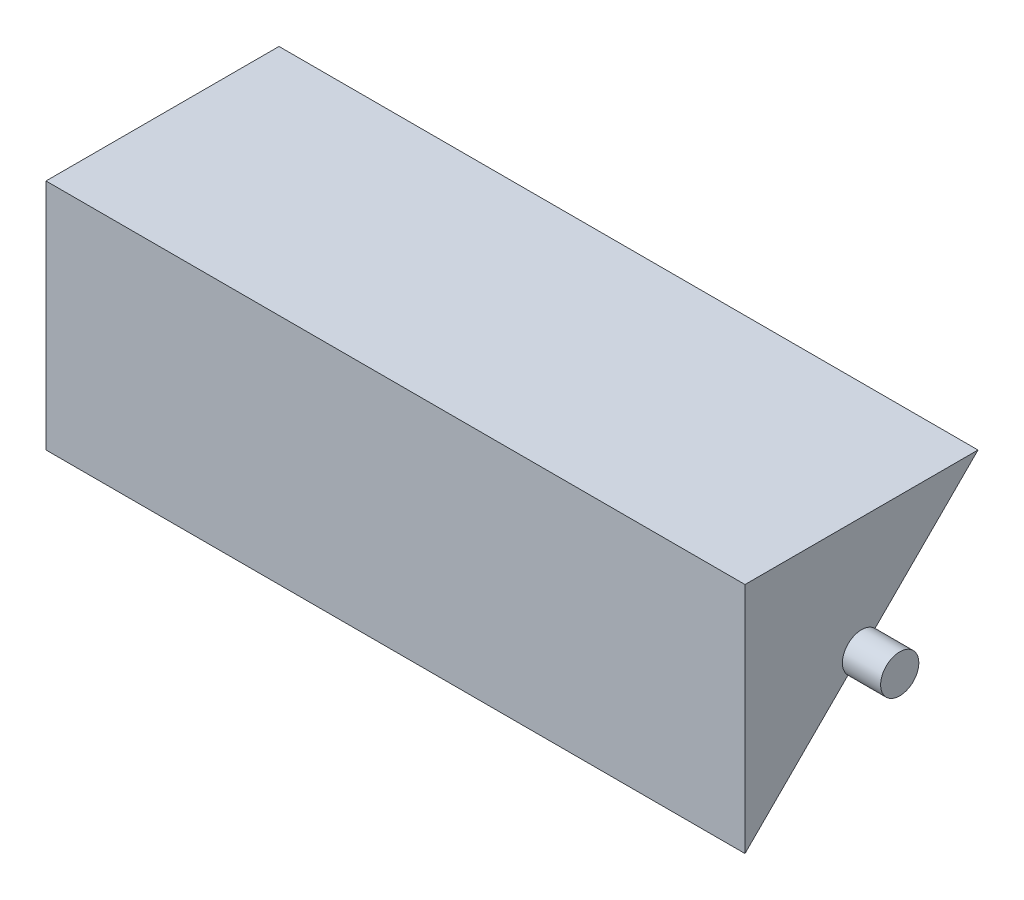
ISO-10303-21;
HEADER;
FILE_DESCRIPTION(('STEP AP214'),'2;1');
FILE_NAME('part.step','',(''),(''),'','','');
FILE_SCHEMA(('AUTOMOTIVE_DESIGN { 1 0 10303 214 1 1 1 1 }'));
ENDSEC;
DATA;
#1=APPLICATION_CONTEXT('core data for automotive mechanical design processes');
#2=APPLICATION_PROTOCOL_DEFINITION('international standard','automotive_design',2000,#1);
#3=PRODUCT_CONTEXT('',#1,'mechanical');
#4=PRODUCT('Part','Part','',(#3));
#5=PRODUCT_RELATED_PRODUCT_CATEGORY('part','',(#4));
#6=PRODUCT_DEFINITION_FORMATION('','',#4);
#7=PRODUCT_DEFINITION_CONTEXT('part definition',#1,'design');
#8=PRODUCT_DEFINITION('design','',#6,#7);
#9=PRODUCT_DEFINITION_SHAPE('','',#8);
#10=(LENGTH_UNIT() NAMED_UNIT(*) SI_UNIT(.MILLI.,.METRE.));
#11=(NAMED_UNIT(*) PLANE_ANGLE_UNIT() SI_UNIT($,.RADIAN.));
#12=(NAMED_UNIT(*) SI_UNIT($,.STERADIAN.) SOLID_ANGLE_UNIT());
#13=UNCERTAINTY_MEASURE_WITH_UNIT(LENGTH_MEASURE(1.E-05),#10,'distance_accuracy_value','');
#14=(GEOMETRIC_REPRESENTATION_CONTEXT(3) GLOBAL_UNCERTAINTY_ASSIGNED_CONTEXT((#13)) GLOBAL_UNIT_ASSIGNED_CONTEXT((#10,
#11,#12)) REPRESENTATION_CONTEXT('',''));
#15=CARTESIAN_POINT('',(0.,0.,0.));
#16=DIRECTION('',(0.,0.,1.));
#17=DIRECTION('',(1.,0.,0.));
#18=AXIS2_PLACEMENT_3D('',#15,#16,#17);
#19=CARTESIAN_POINT('',(-888.252293811319,-152.4,304.8));
#20=DIRECTION('',(0.,0.707106781186547,0.707106781186548));
#21=DIRECTION('',(0.,-0.707106781186548,0.707106781186547));
#22=AXIS2_PLACEMENT_3D('',#19,#20,#21);
#23=PLANE('',#22);
#24=DIRECTION('',(0.,0.707106781186548,-0.707106781186547));
#25=VECTOR('',#24,1.);
#26=CARTESIAN_POINT('',(-457.2,-152.4,304.8));
#27=LINE('',#26,#25);
#28=CARTESIAN_POINT('',(-457.2,-152.4,304.8));
#29=VERTEX_POINT('',#28);
#30=CARTESIAN_POINT('',(-457.2,-17.6776695296637,170.077669529664));
#31=VERTEX_POINT('',#30);
#32=EDGE_CURVE('E120',#29,#31,#27,.T.);
#33=ORIENTED_EDGE('',*,*,#32,.T.);
#34=DIRECTION('',(1.,0.,0.));
#35=VECTOR('',#34,1.);
#36=CARTESIAN_POINT('',(-518.8,-17.6776695296637,170.077669529664));
#37=LINE('',#36,#35);
#38=CARTESIAN_POINT('',(457.2,-17.6776695296637,170.077669529664));
#39=VERTEX_POINT('',#38);
#40=EDGE_CURVE('E11',#31,#39,#37,.T.);
#41=ORIENTED_EDGE('',*,*,#40,.T.);
#42=DIRECTION('',(0.,-0.707106781186548,0.707106781186547));
#43=VECTOR('',#42,1.);
#44=CARTESIAN_POINT('',(457.2,-152.4,304.8));
#45=LINE('',#44,#43);
#46=CARTESIAN_POINT('',(457.2,-152.4,304.8));
#47=VERTEX_POINT('',#46);
#48=EDGE_CURVE('E111',#39,#47,#45,.T.);
#49=ORIENTED_EDGE('',*,*,#48,.T.);
#50=DIRECTION('',(1.,0.,0.));
#51=VECTOR('',#50,1.);
#52=CARTESIAN_POINT('',(-457.2,-152.4,304.8));
#53=LINE('',#52,#51);
#54=EDGE_CURVE('E86',#29,#47,#53,.T.);
#55=ORIENTED_EDGE('',*,*,#54,.F.);
#56=EDGE_LOOP('',(#33,#41,#49,#55));
#57=FACE_BOUND('',#56,.T.);
#58=ADVANCED_FACE('F43',(#57),#23,.F.);
#59=CARTESIAN_POINT('',(457.2,-152.4,304.8));
#60=DIRECTION('',(-1.,0.,0.));
#61=DIRECTION('',(0.,0.,1.));
#62=AXIS2_PLACEMENT_3D('',#59,#60,#61);
#63=PLANE('',#62);
#64=ORIENTED_EDGE('',*,*,#48,.F.);
#65=CARTESIAN_POINT('',(457.2,0.,152.4));
#66=DIRECTION('',(-1.,0.,0.));
#67=DIRECTION('',(0.,0.,1.));
#68=AXIS2_PLACEMENT_3D('',#65,#66,#67);
#69=CIRCLE('',#68,25.);
#70=CARTESIAN_POINT('',(457.2,17.6776695296637,134.722330470336));
#71=VERTEX_POINT('',#70);
#72=EDGE_CURVE('E100',#39,#71,#69,.T.);
#73=ORIENTED_EDGE('',*,*,#72,.T.);
#74=CARTESIAN_POINT('',(457.2,152.4,0.));
#75=VERTEX_POINT('',#74);
#76=EDGE_CURVE('E108',#75,#71,#45,.T.);
#77=ORIENTED_EDGE('',*,*,#76,.F.);
#78=DIRECTION('',(0.,0.,-1.));
#79=VECTOR('',#78,1.);
#80=CARTESIAN_POINT('',(457.2,152.4,304.8));
#81=LINE('',#80,#79);
#82=CARTESIAN_POINT('',(457.2,152.4,304.8));
#83=VERTEX_POINT('',#82);
#84=EDGE_CURVE('E103',#83,#75,#81,.T.);
#85=ORIENTED_EDGE('',*,*,#84,.F.);
#86=DIRECTION('',(0.,1.,0.));
#87=VECTOR('',#86,1.);
#88=CARTESIAN_POINT('',(457.2,-152.4,304.8));
#89=LINE('',#88,#87);
#90=EDGE_CURVE('E123',#47,#83,#89,.T.);
#91=ORIENTED_EDGE('',*,*,#90,.F.);
#92=EDGE_LOOP('',(#64,#73,#77,#85,#91));
#93=FACE_BOUND('',#92,.T.);
#94=ADVANCED_FACE('F45',(#93),#63,.F.);
#95=CARTESIAN_POINT('',(-457.2,152.4,304.8));
#96=DIRECTION('',(0.,-1.,0.));
#97=DIRECTION('',(0.,0.,-1.));
#98=AXIS2_PLACEMENT_3D('',#95,#96,#97);
#99=PLANE('',#98);
#100=DIRECTION('',(-1.,0.,0.));
#101=VECTOR('',#100,1.);
#102=CARTESIAN_POINT('',(-457.2,152.4,0.));
#103=LINE('',#102,#101);
#104=CARTESIAN_POINT('',(-457.2,152.4,0.));
#105=VERTEX_POINT('',#104);
#106=EDGE_CURVE('E115',#75,#105,#103,.T.);
#107=ORIENTED_EDGE('',*,*,#106,.T.);
#108=DIRECTION('',(0.,0.,-1.));
#109=VECTOR('',#108,1.);
#110=CARTESIAN_POINT('',(-457.2,152.4,304.8));
#111=LINE('',#110,#109);
#112=CARTESIAN_POINT('',(-457.2,152.4,304.8));
#113=VERTEX_POINT('',#112);
#114=EDGE_CURVE('E133',#113,#105,#111,.T.);
#115=ORIENTED_EDGE('',*,*,#114,.F.);
#116=DIRECTION('',(-1.,0.,0.));
#117=VECTOR('',#116,1.);
#118=CARTESIAN_POINT('',(-457.2,152.4,304.8));
#119=LINE('',#118,#117);
#120=EDGE_CURVE('E68',#83,#113,#119,.T.);
#121=ORIENTED_EDGE('',*,*,#120,.F.);
#122=ORIENTED_EDGE('',*,*,#84,.T.);
#123=EDGE_LOOP('',(#107,#115,#121,#122));
#124=FACE_BOUND('',#123,.T.);
#125=ADVANCED_FACE('F141',(#124),#99,.F.);
#126=CARTESIAN_POINT('',(-457.2,-152.4,304.8));
#127=DIRECTION('',(1.,0.,0.));
#128=DIRECTION('',(0.,0.,-1.));
#129=AXIS2_PLACEMENT_3D('',#126,#127,#128);
#130=PLANE('',#129);
#131=CARTESIAN_POINT('',(-457.2,17.6776695296637,134.722330470336));
#132=VERTEX_POINT('',#131);
#133=EDGE_CURVE('E78',#132,#105,#27,.T.);
#134=ORIENTED_EDGE('',*,*,#133,.F.);
#135=CARTESIAN_POINT('',(-457.2,0.,152.4));
#136=DIRECTION('',(1.,0.,0.));
#137=DIRECTION('',(0.,0.,-1.));
#138=AXIS2_PLACEMENT_3D('',#135,#136,#137);
#139=CIRCLE('',#138,25.);
#140=EDGE_CURVE('E59',#132,#31,#139,.T.);
#141=ORIENTED_EDGE('',*,*,#140,.T.);
#142=ORIENTED_EDGE('',*,*,#32,.F.);
#143=DIRECTION('',(0.,-1.,0.));
#144=VECTOR('',#143,1.);
#145=CARTESIAN_POINT('',(-457.2,-152.4,304.8));
#146=LINE('',#145,#144);
#147=EDGE_CURVE('E128',#113,#29,#146,.T.);
#148=ORIENTED_EDGE('',*,*,#147,.F.);
#149=ORIENTED_EDGE('',*,*,#114,.T.);
#150=EDGE_LOOP('',(#134,#141,#142,#148,#149));
#151=FACE_BOUND('',#150,.T.);
#152=ADVANCED_FACE('F145',(#151),#130,.F.);
#153=CARTESIAN_POINT('',(0.,0.,304.8));
#154=DIRECTION('',(0.,0.,-1.));
#155=DIRECTION('',(-1.,0.,0.));
#156=AXIS2_PLACEMENT_3D('',#153,#154,#155);
#157=PLANE('',#156);
#158=ORIENTED_EDGE('',*,*,#90,.T.);
#159=ORIENTED_EDGE('',*,*,#120,.T.);
#160=ORIENTED_EDGE('',*,*,#147,.T.);
#161=ORIENTED_EDGE('',*,*,#54,.T.);
#162=EDGE_LOOP('',(#158,#159,#160,#161));
#163=FACE_BOUND('',#162,.T.);
#164=ADVANCED_FACE('F142',(#163),#157,.F.);
#165=ORIENTED_EDGE('',*,*,#76,.T.);
#166=DIRECTION('',(1.,0.,0.));
#167=VECTOR('',#166,1.);
#168=CARTESIAN_POINT('',(-518.8,17.6776695296637,134.722330470336));
#169=LINE('',#168,#167);
#170=EDGE_CURVE('E52',#71,#132,#169,.F.);
#171=ORIENTED_EDGE('',*,*,#170,.T.);
#172=ORIENTED_EDGE('',*,*,#133,.T.);
#173=ORIENTED_EDGE('',*,*,#106,.F.);
#174=EDGE_LOOP('',(#165,#171,#172,#173));
#175=FACE_BOUND('',#174,.T.);
#176=ADVANCED_FACE('F114',(#175),#23,.F.);
#177=CARTESIAN_POINT('',(-518.8,0.,152.4));
#178=DIRECTION('',(1.,0.,0.));
#179=DIRECTION('',(0.,0.,-1.));
#180=AXIS2_PLACEMENT_3D('',#177,#178,#179);
#181=CYLINDRICAL_SURFACE('',#180,25.);
#182=CARTESIAN_POINT('',(507.2,0.,152.4));
#183=DIRECTION('',(1.,0.,0.));
#184=DIRECTION('',(0.,0.,-1.));
#185=AXIS2_PLACEMENT_3D('',#182,#183,#184);
#186=CIRCLE('',#185,25.);
#187=CARTESIAN_POINT('',(507.2,0.,127.4));
#188=VERTEX_POINT('',#187);
#189=EDGE_CURVE('E213',#188,#188,#186,.T.);
#190=ORIENTED_EDGE('',*,*,#189,.F.);
#191=EDGE_LOOP('',(#190));
#192=FACE_BOUND('',#191,.T.);
#193=CARTESIAN_POINT('',(-518.8,0.,152.4));
#194=DIRECTION('',(1.,0.,0.));
#195=DIRECTION('',(0.,0.,-1.));
#196=AXIS2_PLACEMENT_3D('',#193,#194,#195);
#197=CIRCLE('',#196,25.);
#198=CARTESIAN_POINT('',(-518.8,0.,127.4));
#199=VERTEX_POINT('',#198);
#200=EDGE_CURVE('E215',#199,#199,#197,.T.);
#201=ORIENTED_EDGE('',*,*,#200,.T.);
#202=EDGE_LOOP('',(#201));
#203=FACE_BOUND('',#202,.T.);
#204=ORIENTED_EDGE('',*,*,#40,.F.);
#205=ORIENTED_EDGE('',*,*,#140,.F.);
#206=ORIENTED_EDGE('',*,*,#170,.F.);
#207=ORIENTED_EDGE('',*,*,#72,.F.);
#208=EDGE_LOOP('',(#204,#205,#206,#207));
#209=FACE_BOUND('',#208,.T.);
#210=ADVANCED_FACE('F99',(#192,#203,#209),#181,.T.);
#211=CARTESIAN_POINT('',(-518.8,0.,152.4));
#212=DIRECTION('',(1.,0.,0.));
#213=DIRECTION('',(0.,0.,-1.));
#214=AXIS2_PLACEMENT_3D('',#211,#212,#213);
#215=PLANE('',#214);
#216=ORIENTED_EDGE('',*,*,#200,.F.);
#217=EDGE_LOOP('',(#216));
#218=FACE_BOUND('',#217,.T.);
#219=ADVANCED_FACE('F159',(#218),#215,.F.);
#220=CARTESIAN_POINT('',(507.2,0.,152.4));
#221=DIRECTION('',(1.,0.,0.));
#222=DIRECTION('',(0.,0.,-1.));
#223=AXIS2_PLACEMENT_3D('',#220,#221,#222);
#224=PLANE('',#223);
#225=ORIENTED_EDGE('',*,*,#189,.T.);
#226=EDGE_LOOP('',(#225));
#227=FACE_BOUND('',#226,.T.);
#228=ADVANCED_FACE('F197',(#227),#224,.T.);
#229=CLOSED_SHELL('',(#58,#94,#125,#152,#164,#176,#210,#219,#228));
#230=MANIFOLD_SOLID_BREP('B2',#229);
#231=ADVANCED_BREP_SHAPE_REPRESENTATION('',(#18,#230),#14);
#232=SHAPE_DEFINITION_REPRESENTATION(#9,#231);
ENDSEC;
END-ISO-10303-21;
